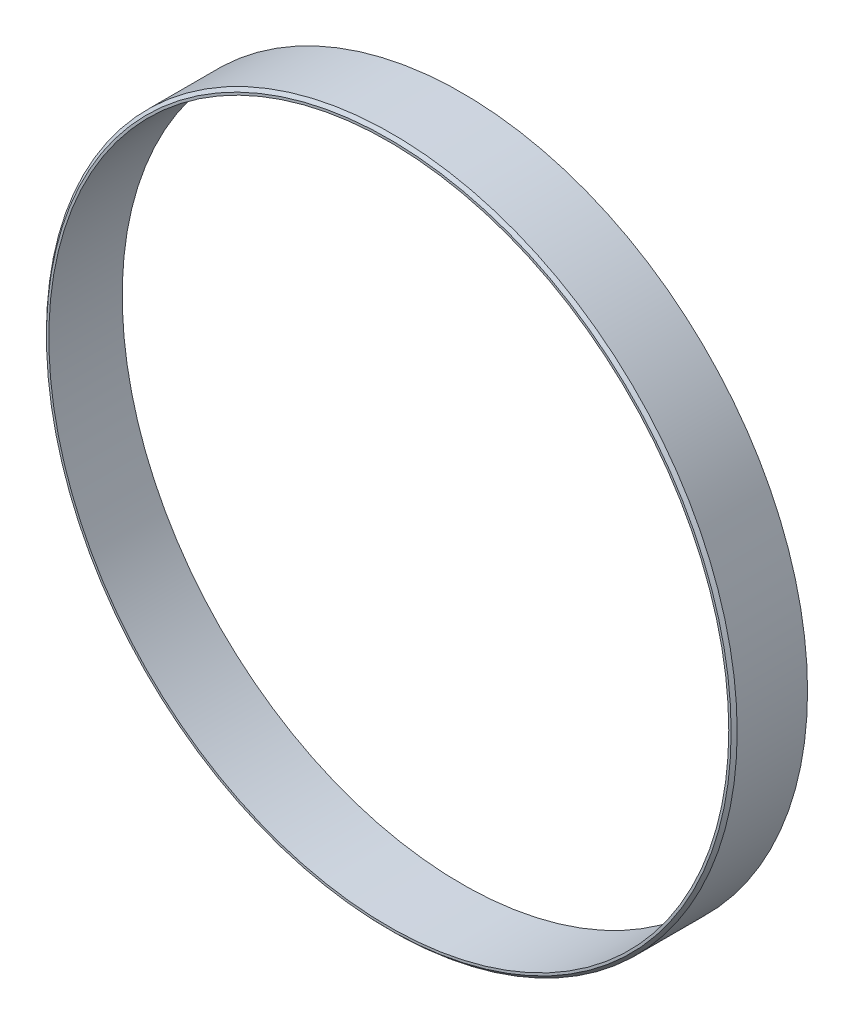
ISO-10303-21;
HEADER;
FILE_DESCRIPTION(('STEP AP214'),'2;1');
FILE_NAME('part.step','',(''),(''),'','','');
FILE_SCHEMA(('AUTOMOTIVE_DESIGN { 1 0 10303 214 1 1 1 1 }'));
ENDSEC;
DATA;
#1=APPLICATION_CONTEXT('core data for automotive mechanical design processes');
#2=APPLICATION_PROTOCOL_DEFINITION('international standard','automotive_design',2000,#1);
#3=PRODUCT_CONTEXT('',#1,'mechanical');
#4=PRODUCT('Part','Part','',(#3));
#5=PRODUCT_RELATED_PRODUCT_CATEGORY('part','',(#4));
#6=PRODUCT_DEFINITION_FORMATION('','',#4);
#7=PRODUCT_DEFINITION_CONTEXT('part definition',#1,'design');
#8=PRODUCT_DEFINITION('design','',#6,#7);
#9=PRODUCT_DEFINITION_SHAPE('','',#8);
#10=(LENGTH_UNIT() NAMED_UNIT(*) SI_UNIT(.MILLI.,.METRE.));
#11=(NAMED_UNIT(*) PLANE_ANGLE_UNIT() SI_UNIT($,.RADIAN.));
#12=(NAMED_UNIT(*) SI_UNIT($,.STERADIAN.) SOLID_ANGLE_UNIT());
#13=UNCERTAINTY_MEASURE_WITH_UNIT(LENGTH_MEASURE(1.E-05),#10,'distance_accuracy_value','');
#14=(GEOMETRIC_REPRESENTATION_CONTEXT(3) GLOBAL_UNCERTAINTY_ASSIGNED_CONTEXT((#13)) GLOBAL_UNIT_ASSIGNED_CONTEXT((#10,
#11,#12)) REPRESENTATION_CONTEXT('',''));
#15=CARTESIAN_POINT('',(0.,0.,0.));
#16=DIRECTION('',(0.,0.,1.));
#17=DIRECTION('',(1.,0.,0.));
#18=AXIS2_PLACEMENT_3D('',#15,#16,#17);
#19=CARTESIAN_POINT('',(0.,0.,17.));
#20=DIRECTION('',(0.,0.,1.));
#21=DIRECTION('',(1.,0.,0.));
#22=AXIS2_PLACEMENT_3D('',#19,#20,#21);
#23=PLANE('',#22);
#24=CARTESIAN_POINT('',(0.,0.,17.));
#25=DIRECTION('',(0.,0.,1.));
#26=DIRECTION('',(1.,0.,0.));
#27=AXIS2_PLACEMENT_3D('',#24,#25,#26);
#28=CIRCLE('',#27,79.3);
#29=CARTESIAN_POINT('',(79.3,0.,17.));
#30=VERTEX_POINT('',#29);
#31=EDGE_CURVE('E40',#30,#30,#28,.T.);
#32=ORIENTED_EDGE('',*,*,#31,.T.);
#33=EDGE_LOOP('',(#32));
#34=FACE_BOUND('',#33,.T.);
#35=CARTESIAN_POINT('',(0.,0.,17.));
#36=DIRECTION('',(0.,0.,1.));
#37=DIRECTION('',(1.,0.,0.));
#38=AXIS2_PLACEMENT_3D('',#35,#36,#37);
#39=CIRCLE('',#38,78.75);
#40=CARTESIAN_POINT('',(78.75,0.,17.));
#41=VERTEX_POINT('',#40);
#42=EDGE_CURVE('E48',#41,#41,#39,.T.);
#43=ORIENTED_EDGE('',*,*,#42,.F.);
#44=EDGE_LOOP('',(#43));
#45=FACE_BOUND('',#44,.T.);
#46=ADVANCED_FACE('F33',(#34,#45),#23,.T.);
#47=CARTESIAN_POINT('',(0.,0.,0.));
#48=DIRECTION('',(0.,0.,1.));
#49=DIRECTION('',(1.,0.,0.));
#50=AXIS2_PLACEMENT_3D('',#47,#48,#49);
#51=PLANE('',#50);
#52=CARTESIAN_POINT('',(0.,0.,0.));
#53=DIRECTION('',(0.,0.,1.));
#54=DIRECTION('',(1.,0.,0.));
#55=AXIS2_PLACEMENT_3D('',#52,#53,#54);
#56=CIRCLE('',#55,80.);
#57=CARTESIAN_POINT('',(80.,0.,0.));
#58=VERTEX_POINT('',#57);
#59=EDGE_CURVE('E44',#58,#58,#56,.T.);
#60=ORIENTED_EDGE('',*,*,#59,.F.);
#61=EDGE_LOOP('',(#60));
#62=FACE_BOUND('',#61,.T.);
#63=CARTESIAN_POINT('',(0.,0.,0.));
#64=DIRECTION('',(0.,0.,1.));
#65=DIRECTION('',(1.,0.,0.));
#66=AXIS2_PLACEMENT_3D('',#63,#64,#65);
#67=CIRCLE('',#66,78.75);
#68=CARTESIAN_POINT('',(78.75,0.,0.));
#69=VERTEX_POINT('',#68);
#70=EDGE_CURVE('E51',#69,#69,#67,.T.);
#71=ORIENTED_EDGE('',*,*,#70,.T.);
#72=EDGE_LOOP('',(#71));
#73=FACE_BOUND('',#72,.T.);
#74=ADVANCED_FACE('F61',(#62,#73),#51,.F.);
#75=CARTESIAN_POINT('',(0.,0.,17.));
#76=DIRECTION('',(0.,0.,-1.));
#77=DIRECTION('',(-1.,0.,0.));
#78=AXIS2_PLACEMENT_3D('',#75,#76,#77);
#79=CYLINDRICAL_SURFACE('',#78,80.);
#80=CARTESIAN_POINT('',(0.,0.,16.3));
#81=DIRECTION('',(0.,0.,1.));
#82=DIRECTION('',(1.,0.,0.));
#83=AXIS2_PLACEMENT_3D('',#80,#81,#82);
#84=CIRCLE('',#83,80.);
#85=CARTESIAN_POINT('',(80.,0.,16.3));
#86=VERTEX_POINT('',#85);
#87=EDGE_CURVE('E10',#86,#86,#84,.F.);
#88=ORIENTED_EDGE('',*,*,#87,.T.);
#89=EDGE_LOOP('',(#88));
#90=FACE_BOUND('',#89,.T.);
#91=ORIENTED_EDGE('',*,*,#59,.T.);
#92=EDGE_LOOP('',(#91));
#93=FACE_BOUND('',#92,.T.);
#94=ADVANCED_FACE('F66',(#90,#93),#79,.T.);
#95=CARTESIAN_POINT('',(0.,0.,17.));
#96=DIRECTION('',(0.,0.,-1.));
#97=DIRECTION('',(-1.,0.,0.));
#98=AXIS2_PLACEMENT_3D('',#95,#96,#97);
#99=CYLINDRICAL_SURFACE('',#98,78.75);
#100=ORIENTED_EDGE('',*,*,#42,.T.);
#101=EDGE_LOOP('',(#100));
#102=FACE_BOUND('',#101,.T.);
#103=ORIENTED_EDGE('',*,*,#70,.F.);
#104=EDGE_LOOP('',(#103));
#105=FACE_BOUND('',#104,.T.);
#106=ADVANCED_FACE('F57',(#102,#105),#99,.F.);
#107=CARTESIAN_POINT('',(0.,0.,17.));
#108=DIRECTION('',(0.,0.,-1.));
#109=DIRECTION('',(-1.,0.,0.));
#110=AXIS2_PLACEMENT_3D('',#107,#108,#109);
#111=CONICAL_SURFACE('',#110,79.3,0.785398163397448);
#112=ORIENTED_EDGE('',*,*,#87,.F.);
#113=EDGE_LOOP('',(#112));
#114=FACE_BOUND('',#113,.T.);
#115=ORIENTED_EDGE('',*,*,#31,.F.);
#116=EDGE_LOOP('',(#115));
#117=FACE_BOUND('',#116,.T.);
#118=ADVANCED_FACE('F35',(#114,#117),#111,.T.);
#119=CLOSED_SHELL('',(#46,#74,#94,#106,#118));
#120=MANIFOLD_SOLID_BREP('B2',#119);
#121=ADVANCED_BREP_SHAPE_REPRESENTATION('',(#18,#120),#14);
#122=SHAPE_DEFINITION_REPRESENTATION(#9,#121);
ENDSEC;
END-ISO-10303-21;
